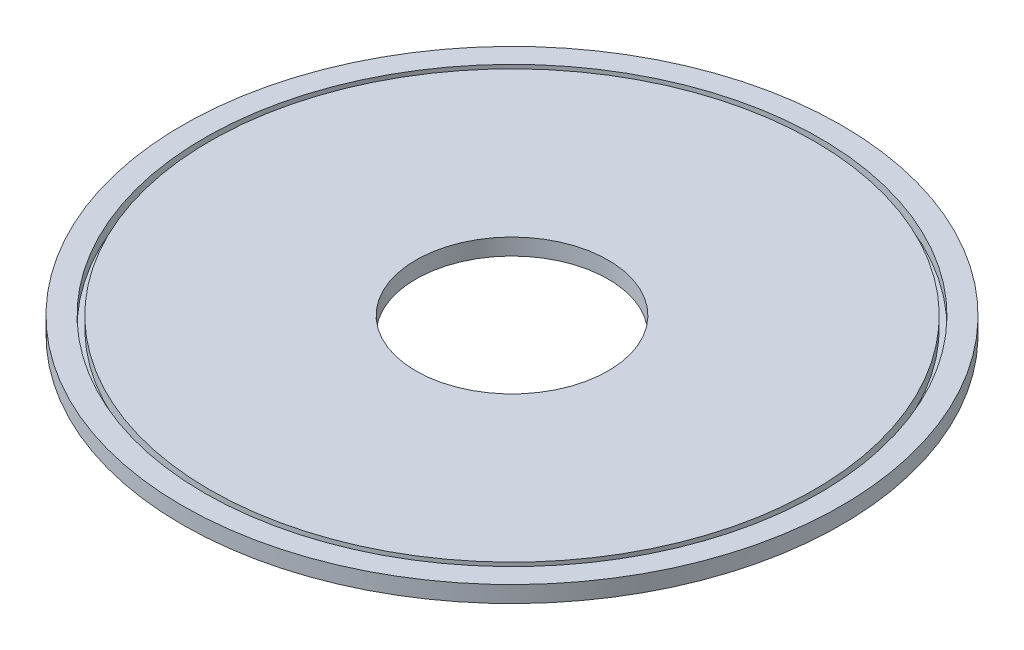
ISO-10303-21;
HEADER;
FILE_DESCRIPTION(('STEP AP214'),'2;1');
FILE_NAME('part.step','',(''),(''),'','','');
FILE_SCHEMA(('AUTOMOTIVE_DESIGN { 1 0 10303 214 1 1 1 1 }'));
ENDSEC;
DATA;
#1=APPLICATION_CONTEXT('core data for automotive mechanical design processes');
#2=APPLICATION_PROTOCOL_DEFINITION('international standard','automotive_design',2000,#1);
#3=PRODUCT_CONTEXT('',#1,'mechanical');
#4=PRODUCT('Part','Part','',(#3));
#5=PRODUCT_RELATED_PRODUCT_CATEGORY('part','',(#4));
#6=PRODUCT_DEFINITION_FORMATION('','',#4);
#7=PRODUCT_DEFINITION_CONTEXT('part definition',#1,'design');
#8=PRODUCT_DEFINITION('design','',#6,#7);
#9=PRODUCT_DEFINITION_SHAPE('','',#8);
#10=(LENGTH_UNIT() NAMED_UNIT(*) SI_UNIT(.MILLI.,.METRE.));
#11=(NAMED_UNIT(*) PLANE_ANGLE_UNIT() SI_UNIT($,.RADIAN.));
#12=(NAMED_UNIT(*) SI_UNIT($,.STERADIAN.) SOLID_ANGLE_UNIT());
#13=UNCERTAINTY_MEASURE_WITH_UNIT(LENGTH_MEASURE(1.E-05),#10,'distance_accuracy_value','');
#14=(GEOMETRIC_REPRESENTATION_CONTEXT(3) GLOBAL_UNCERTAINTY_ASSIGNED_CONTEXT((#13)) GLOBAL_UNIT_ASSIGNED_CONTEXT((#10,
#11,#12)) REPRESENTATION_CONTEXT('',''));
#15=CARTESIAN_POINT('',(0.,0.,0.));
#16=DIRECTION('',(0.,0.,1.));
#17=DIRECTION('',(1.,0.,0.));
#18=AXIS2_PLACEMENT_3D('',#15,#16,#17);
#19=CARTESIAN_POINT('',(0.,15.,0.));
#20=DIRECTION('',(0.,1.,0.));
#21=DIRECTION('',(0.,0.,1.));
#22=AXIS2_PLACEMENT_3D('',#19,#20,#21);
#23=PLANE('',#22);
#24=CARTESIAN_POINT('',(0.,15.,0.));
#25=DIRECTION('',(0.,1.,0.));
#26=DIRECTION('',(0.,0.,1.));
#27=AXIS2_PLACEMENT_3D('',#24,#25,#26);
#28=CIRCLE('',#27,87.5);
#29=CARTESIAN_POINT('',(0.,15.,87.5));
#30=VERTEX_POINT('',#29);
#31=EDGE_CURVE('E50',#30,#30,#28,.T.);
#32=ORIENTED_EDGE('',*,*,#31,.F.);
#33=EDGE_LOOP('',(#32));
#34=FACE_BOUND('',#33,.T.);
#35=CARTESIAN_POINT('',(0.,15.,0.));
#36=DIRECTION('',(0.,1.,0.));
#37=DIRECTION('',(0.,0.,1.));
#38=AXIS2_PLACEMENT_3D('',#35,#36,#37);
#39=CIRCLE('',#38,275.);
#40=CARTESIAN_POINT('',(0.,15.,275.));
#41=VERTEX_POINT('',#40);
#42=EDGE_CURVE('E62',#41,#41,#39,.T.);
#43=ORIENTED_EDGE('',*,*,#42,.T.);
#44=EDGE_LOOP('',(#43));
#45=FACE_BOUND('',#44,.T.);
#46=ADVANCED_FACE('F37',(#34,#45),#23,.T.);
#47=CARTESIAN_POINT('',(0.,15.,0.));
#48=DIRECTION('',(0.,-1.,0.));
#49=DIRECTION('',(0.,0.,-1.));
#50=AXIS2_PLACEMENT_3D('',#47,#48,#49);
#51=CYLINDRICAL_SURFACE('',#50,300.);
#52=CARTESIAN_POINT('',(0.,15.,0.));
#53=DIRECTION('',(0.,1.,0.));
#54=DIRECTION('',(0.,0.,1.));
#55=AXIS2_PLACEMENT_3D('',#52,#53,#54);
#56=CIRCLE('',#55,300.);
#57=CARTESIAN_POINT('',(0.,15.,300.));
#58=VERTEX_POINT('',#57);
#59=EDGE_CURVE('E10',#58,#58,#56,.T.);
#60=ORIENTED_EDGE('',*,*,#59,.F.);
#61=EDGE_LOOP('',(#60));
#62=FACE_BOUND('',#61,.T.);
#63=CARTESIAN_POINT('',(0.,0.,0.));
#64=DIRECTION('',(0.,1.,0.));
#65=DIRECTION('',(0.,0.,1.));
#66=AXIS2_PLACEMENT_3D('',#63,#64,#65);
#67=CIRCLE('',#66,300.);
#68=CARTESIAN_POINT('',(0.,0.,300.));
#69=VERTEX_POINT('',#68);
#70=EDGE_CURVE('E41',#69,#69,#67,.T.);
#71=ORIENTED_EDGE('',*,*,#70,.T.);
#72=EDGE_LOOP('',(#71));
#73=FACE_BOUND('',#72,.T.);
#74=ADVANCED_FACE('F39',(#62,#73),#51,.T.);
#75=CARTESIAN_POINT('',(0.,15.,0.));
#76=DIRECTION('',(0.,1.,0.));
#77=DIRECTION('',(0.,0.,1.));
#78=AXIS2_PLACEMENT_3D('',#75,#76,#77);
#79=CIRCLE('',#78,280.);
#80=CARTESIAN_POINT('',(0.,15.,280.));
#81=VERTEX_POINT('',#80);
#82=EDGE_CURVE('E56',#81,#81,#79,.T.);
#83=ORIENTED_EDGE('',*,*,#82,.F.);
#84=EDGE_LOOP('',(#83));
#85=FACE_BOUND('',#84,.T.);
#86=ORIENTED_EDGE('',*,*,#59,.T.);
#87=EDGE_LOOP('',(#86));
#88=FACE_BOUND('',#87,.T.);
#89=ADVANCED_FACE('F84',(#85,#88),#23,.T.);
#90=CARTESIAN_POINT('',(0.,0.,0.));
#91=DIRECTION('',(0.,1.,0.));
#92=DIRECTION('',(0.,0.,1.));
#93=AXIS2_PLACEMENT_3D('',#90,#91,#92);
#94=PLANE('',#93);
#95=CARTESIAN_POINT('',(0.,0.,0.));
#96=DIRECTION('',(0.,1.,0.));
#97=DIRECTION('',(0.,0.,1.));
#98=AXIS2_PLACEMENT_3D('',#95,#96,#97);
#99=CIRCLE('',#98,87.5);
#100=CARTESIAN_POINT('',(0.,0.,87.5));
#101=VERTEX_POINT('',#100);
#102=EDGE_CURVE('E48',#101,#101,#99,.T.);
#103=ORIENTED_EDGE('',*,*,#102,.T.);
#104=EDGE_LOOP('',(#103));
#105=FACE_BOUND('',#104,.T.);
#106=ORIENTED_EDGE('',*,*,#70,.F.);
#107=EDGE_LOOP('',(#106));
#108=FACE_BOUND('',#107,.T.);
#109=ADVANCED_FACE('F86',(#105,#108),#94,.F.);
#110=CARTESIAN_POINT('',(0.,0.,0.));
#111=DIRECTION('',(0.,1.,0.));
#112=DIRECTION('',(0.,0.,1.));
#113=AXIS2_PLACEMENT_3D('',#110,#111,#112);
#114=CYLINDRICAL_SURFACE('',#113,87.5);
#115=ORIENTED_EDGE('',*,*,#102,.F.);
#116=EDGE_LOOP('',(#115));
#117=FACE_BOUND('',#116,.T.);
#118=ORIENTED_EDGE('',*,*,#31,.T.);
#119=EDGE_LOOP('',(#118));
#120=FACE_BOUND('',#119,.T.);
#121=ADVANCED_FACE('F80',(#117,#120),#114,.F.);
#122=CARTESIAN_POINT('',(0.,5.,0.));
#123=DIRECTION('',(0.,1.,0.));
#124=DIRECTION('',(0.,0.,1.));
#125=AXIS2_PLACEMENT_3D('',#122,#123,#124);
#126=CYLINDRICAL_SURFACE('',#125,280.);
#127=CARTESIAN_POINT('',(0.,5.,0.));
#128=DIRECTION('',(0.,1.,0.));
#129=DIRECTION('',(0.,0.,1.));
#130=AXIS2_PLACEMENT_3D('',#127,#128,#129);
#131=CIRCLE('',#130,280.);
#132=CARTESIAN_POINT('',(0.,5.,280.));
#133=VERTEX_POINT('',#132);
#134=EDGE_CURVE('E53',#133,#133,#131,.T.);
#135=ORIENTED_EDGE('',*,*,#134,.F.);
#136=EDGE_LOOP('',(#135));
#137=FACE_BOUND('',#136,.T.);
#138=ORIENTED_EDGE('',*,*,#82,.T.);
#139=EDGE_LOOP('',(#138));
#140=FACE_BOUND('',#139,.T.);
#141=ADVANCED_FACE('F74',(#137,#140),#126,.F.);
#142=CARTESIAN_POINT('',(0.,5.,0.));
#143=DIRECTION('',(0.,1.,0.));
#144=DIRECTION('',(0.,0.,1.));
#145=AXIS2_PLACEMENT_3D('',#142,#143,#144);
#146=PLANE('',#145);
#147=CARTESIAN_POINT('',(0.,5.,0.));
#148=DIRECTION('',(0.,1.,0.));
#149=DIRECTION('',(0.,0.,1.));
#150=AXIS2_PLACEMENT_3D('',#147,#148,#149);
#151=CIRCLE('',#150,275.);
#152=CARTESIAN_POINT('',(0.,5.,275.));
#153=VERTEX_POINT('',#152);
#154=EDGE_CURVE('E59',#153,#153,#151,.T.);
#155=ORIENTED_EDGE('',*,*,#154,.F.);
#156=EDGE_LOOP('',(#155));
#157=FACE_BOUND('',#156,.T.);
#158=ORIENTED_EDGE('',*,*,#134,.T.);
#159=EDGE_LOOP('',(#158));
#160=FACE_BOUND('',#159,.T.);
#161=ADVANCED_FACE('F71',(#157,#160),#146,.T.);
#162=CARTESIAN_POINT('',(0.,5.,0.));
#163=DIRECTION('',(0.,1.,0.));
#164=DIRECTION('',(0.,0.,1.));
#165=AXIS2_PLACEMENT_3D('',#162,#163,#164);
#166=CYLINDRICAL_SURFACE('',#165,275.);
#167=ORIENTED_EDGE('',*,*,#154,.T.);
#168=EDGE_LOOP('',(#167));
#169=FACE_BOUND('',#168,.T.);
#170=ORIENTED_EDGE('',*,*,#42,.F.);
#171=EDGE_LOOP('',(#170));
#172=FACE_BOUND('',#171,.T.);
#173=ADVANCED_FACE('F68',(#169,#172),#166,.T.);
#174=CLOSED_SHELL('',(#46,#74,#89,#109,#121,#141,#161,#173));
#175=MANIFOLD_SOLID_BREP('B2',#174);
#176=ADVANCED_BREP_SHAPE_REPRESENTATION('',(#18,#175),#14);
#177=SHAPE_DEFINITION_REPRESENTATION(#9,#176);
ENDSEC;
END-ISO-10303-21;
